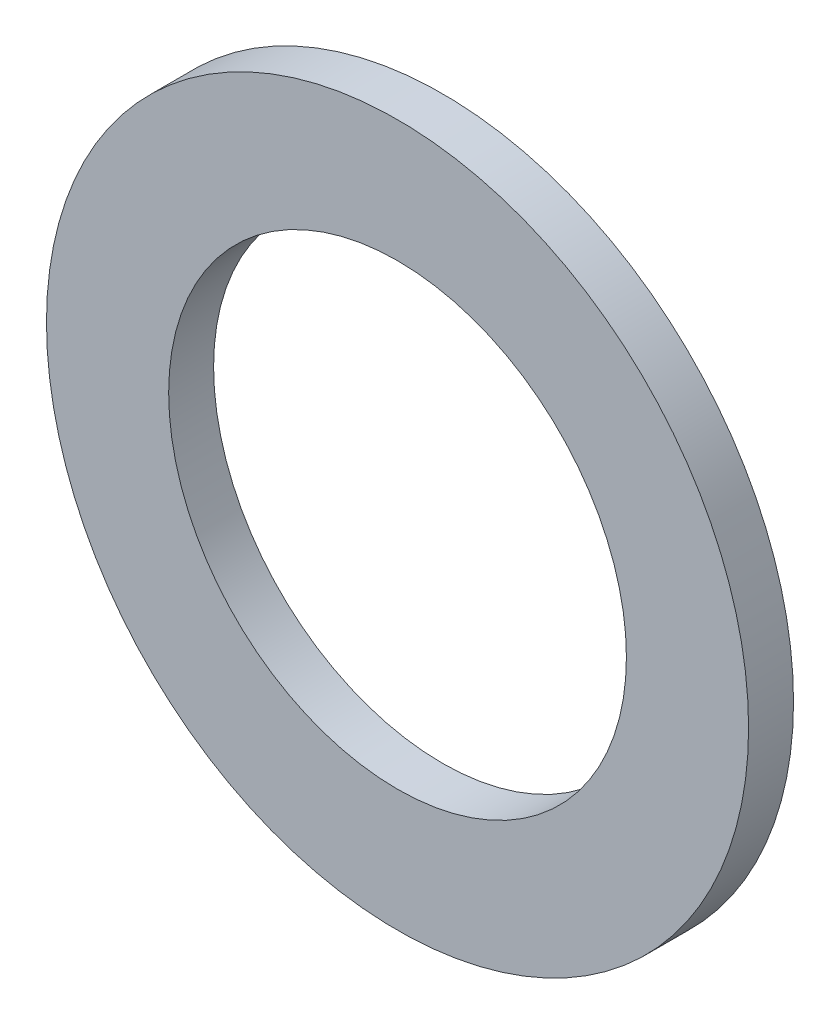
ISO-10303-21;
HEADER;
FILE_DESCRIPTION(('STEP AP214'),'2;1');
FILE_NAME('part.step','',(''),(''),'','','');
FILE_SCHEMA(('AUTOMOTIVE_DESIGN { 1 0 10303 214 1 1 1 1 }'));
ENDSEC;
DATA;
#1=APPLICATION_CONTEXT('core data for automotive mechanical design processes');
#2=APPLICATION_PROTOCOL_DEFINITION('international standard','automotive_design',2000,#1);
#3=PRODUCT_CONTEXT('',#1,'mechanical');
#4=PRODUCT('Part','Part','',(#3));
#5=PRODUCT_RELATED_PRODUCT_CATEGORY('part','',(#4));
#6=PRODUCT_DEFINITION_FORMATION('','',#4);
#7=PRODUCT_DEFINITION_CONTEXT('part definition',#1,'design');
#8=PRODUCT_DEFINITION('design','',#6,#7);
#9=PRODUCT_DEFINITION_SHAPE('','',#8);
#10=(LENGTH_UNIT() NAMED_UNIT(*) SI_UNIT(.MILLI.,.METRE.));
#11=(NAMED_UNIT(*) PLANE_ANGLE_UNIT() SI_UNIT($,.RADIAN.));
#12=(NAMED_UNIT(*) SI_UNIT($,.STERADIAN.) SOLID_ANGLE_UNIT());
#13=UNCERTAINTY_MEASURE_WITH_UNIT(LENGTH_MEASURE(1.E-05),#10,'distance_accuracy_value','');
#14=(GEOMETRIC_REPRESENTATION_CONTEXT(3) GLOBAL_UNCERTAINTY_ASSIGNED_CONTEXT((#13)) GLOBAL_UNIT_ASSIGNED_CONTEXT((#10,
#11,#12)) REPRESENTATION_CONTEXT('',''));
#15=CARTESIAN_POINT('',(0.,0.,0.));
#16=DIRECTION('',(0.,0.,1.));
#17=DIRECTION('',(1.,0.,0.));
#18=AXIS2_PLACEMENT_3D('',#15,#16,#17);
#19=CARTESIAN_POINT('',(0.,0.,3.11070191663087));
#20=DIRECTION('',(0.,0.,1.));
#21=DIRECTION('',(1.,0.,0.));
#22=AXIS2_PLACEMENT_3D('',#19,#20,#21);
#23=CYLINDRICAL_SURFACE('',#22,7.9375);
#24=CARTESIAN_POINT('',(0.,0.,0.));
#25=DIRECTION('',(0.,0.,1.));
#26=DIRECTION('',(1.,0.,0.));
#27=AXIS2_PLACEMENT_3D('',#24,#25,#26);
#28=CIRCLE('',#27,7.9375);
#29=CARTESIAN_POINT('',(7.9375,0.,0.));
#30=VERTEX_POINT('',#29);
#31=EDGE_CURVE('E46',#30,#30,#28,.T.);
#32=ORIENTED_EDGE('',*,*,#31,.F.);
#33=EDGE_LOOP('',(#32));
#34=FACE_BOUND('',#33,.T.);
#35=CARTESIAN_POINT('',(0.,0.,-1.016));
#36=DIRECTION('',(0.,0.,1.));
#37=DIRECTION('',(1.,0.,0.));
#38=AXIS2_PLACEMENT_3D('',#35,#36,#37);
#39=CIRCLE('',#38,7.9375);
#40=CARTESIAN_POINT('',(7.9375,0.,-1.016));
#41=VERTEX_POINT('',#40);
#42=EDGE_CURVE('E10',#41,#41,#39,.T.);
#43=ORIENTED_EDGE('',*,*,#42,.T.);
#44=EDGE_LOOP('',(#43));
#45=FACE_BOUND('',#44,.T.);
#46=ADVANCED_FACE('F32',(#34,#45),#23,.T.);
#47=CARTESIAN_POINT('',(0.,7.9375,-1.016));
#48=DIRECTION('',(0.,0.,1.));
#49=DIRECTION('',(1.,0.,0.));
#50=AXIS2_PLACEMENT_3D('',#47,#48,#49);
#51=PLANE('',#50);
#52=ORIENTED_EDGE('',*,*,#42,.F.);
#53=EDGE_LOOP('',(#52));
#54=FACE_BOUND('',#53,.T.);
#55=CARTESIAN_POINT('',(0.,0.,-1.016));
#56=DIRECTION('',(0.,0.,1.));
#57=DIRECTION('',(1.,0.,0.));
#58=AXIS2_PLACEMENT_3D('',#55,#56,#57);
#59=CIRCLE('',#58,5.175);
#60=CARTESIAN_POINT('',(5.175,0.,-1.016));
#61=VERTEX_POINT('',#60);
#62=EDGE_CURVE('E38',#61,#61,#59,.T.);
#63=ORIENTED_EDGE('',*,*,#62,.T.);
#64=EDGE_LOOP('',(#63));
#65=FACE_BOUND('',#64,.T.);
#66=ADVANCED_FACE('F55',(#54,#65),#51,.F.);
#67=CARTESIAN_POINT('',(0.,0.,3.11070191663087));
#68=DIRECTION('',(0.,0.,1.));
#69=DIRECTION('',(1.,0.,0.));
#70=AXIS2_PLACEMENT_3D('',#67,#68,#69);
#71=CYLINDRICAL_SURFACE('',#70,5.175);
#72=ORIENTED_EDGE('',*,*,#62,.F.);
#73=EDGE_LOOP('',(#72));
#74=FACE_BOUND('',#73,.T.);
#75=CARTESIAN_POINT('',(0.,0.,0.));
#76=DIRECTION('',(0.,0.,1.));
#77=DIRECTION('',(1.,0.,0.));
#78=AXIS2_PLACEMENT_3D('',#75,#76,#77);
#79=CIRCLE('',#78,5.175);
#80=CARTESIAN_POINT('',(5.175,0.,0.));
#81=VERTEX_POINT('',#80);
#82=EDGE_CURVE('E42',#81,#81,#79,.T.);
#83=ORIENTED_EDGE('',*,*,#82,.T.);
#84=EDGE_LOOP('',(#83));
#85=FACE_BOUND('',#84,.T.);
#86=ADVANCED_FACE('F59',(#74,#85),#71,.F.);
#87=CARTESIAN_POINT('',(0.,7.9375,0.));
#88=DIRECTION('',(0.,0.,-1.));
#89=DIRECTION('',(-1.,0.,0.));
#90=AXIS2_PLACEMENT_3D('',#87,#88,#89);
#91=PLANE('',#90);
#92=ORIENTED_EDGE('',*,*,#82,.F.);
#93=EDGE_LOOP('',(#92));
#94=FACE_BOUND('',#93,.T.);
#95=ORIENTED_EDGE('',*,*,#31,.T.);
#96=EDGE_LOOP('',(#95));
#97=FACE_BOUND('',#96,.T.);
#98=ADVANCED_FACE('F52',(#94,#97),#91,.F.);
#99=CLOSED_SHELL('',(#46,#66,#86,#98));
#100=MANIFOLD_SOLID_BREP('B2',#99);
#101=ADVANCED_BREP_SHAPE_REPRESENTATION('',(#18,#100),#14);
#102=SHAPE_DEFINITION_REPRESENTATION(#9,#101);
ENDSEC;
END-ISO-10303-21;
